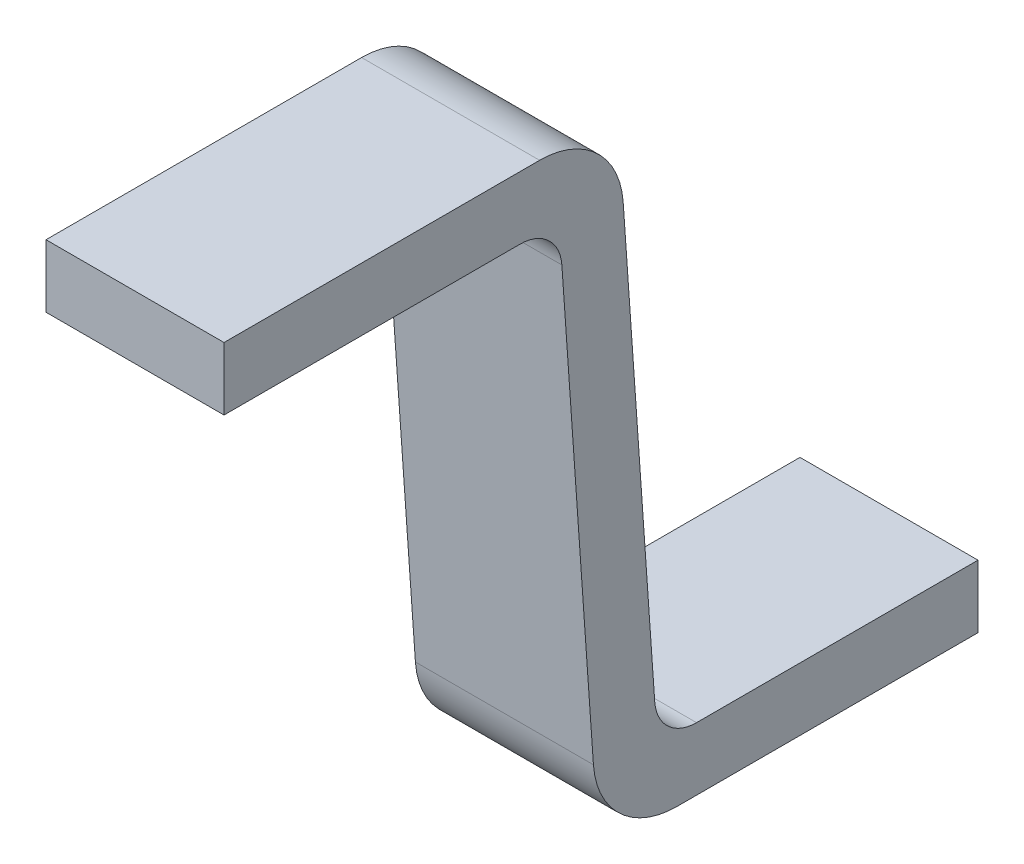
ISO-10303-21;
HEADER;
FILE_DESCRIPTION(('STEP AP214'),'2;1');
FILE_NAME('part.step','',(''),(''),'','','');
FILE_SCHEMA(('AUTOMOTIVE_DESIGN { 1 0 10303 214 1 1 1 1 }'));
ENDSEC;
DATA;
#1=APPLICATION_CONTEXT('core data for automotive mechanical design processes');
#2=APPLICATION_PROTOCOL_DEFINITION('international standard','automotive_design',2000,#1);
#3=PRODUCT_CONTEXT('',#1,'mechanical');
#4=PRODUCT('Part','Part','',(#3));
#5=PRODUCT_RELATED_PRODUCT_CATEGORY('part','',(#4));
#6=PRODUCT_DEFINITION_FORMATION('','',#4);
#7=PRODUCT_DEFINITION_CONTEXT('part definition',#1,'design');
#8=PRODUCT_DEFINITION('design','',#6,#7);
#9=PRODUCT_DEFINITION_SHAPE('','',#8);
#10=(LENGTH_UNIT() NAMED_UNIT(*) SI_UNIT(.MILLI.,.METRE.));
#11=(NAMED_UNIT(*) PLANE_ANGLE_UNIT() SI_UNIT($,.RADIAN.));
#12=(NAMED_UNIT(*) SI_UNIT($,.STERADIAN.) SOLID_ANGLE_UNIT());
#13=UNCERTAINTY_MEASURE_WITH_UNIT(LENGTH_MEASURE(1.E-05),#10,'distance_accuracy_value','');
#14=(GEOMETRIC_REPRESENTATION_CONTEXT(3) GLOBAL_UNCERTAINTY_ASSIGNED_CONTEXT((#13)) GLOBAL_UNIT_ASSIGNED_CONTEXT((#10,
#11,#12)) REPRESENTATION_CONTEXT('',''));
#15=CARTESIAN_POINT('',(0.,0.,0.));
#16=DIRECTION('',(0.,0.,1.));
#17=DIRECTION('',(1.,0.,0.));
#18=AXIS2_PLACEMENT_3D('',#15,#16,#17);
#19=CARTESIAN_POINT('',(0.425,-0.15,-0.506789743356556));
#20=DIRECTION('',(0.,1.,0.));
#21=DIRECTION('',(0.,0.,-1.));
#22=AXIS2_PLACEMENT_3D('',#19,#20,#21);
#23=PLANE('',#22);
#24=DIRECTION('',(0.,0.,-1.));
#25=VECTOR('',#24,1.);
#26=CARTESIAN_POINT('',(0.,-0.15,-0.506789743356556));
#27=LINE('',#26,#25);
#28=CARTESIAN_POINT('',(0.,-0.15,0.2));
#29=VERTEX_POINT('',#28);
#30=CARTESIAN_POINT('',(0.,-0.15,-0.506789743356556));
#31=VERTEX_POINT('',#30);
#32=EDGE_CURVE('E156',#29,#31,#27,.T.);
#33=ORIENTED_EDGE('',*,*,#32,.T.);
#34=DIRECTION('',(-1.,0.,0.));
#35=VECTOR('',#34,1.);
#36=CARTESIAN_POINT('',(0.425,-0.15,-0.506789743356556));
#37=LINE('',#36,#35);
#38=CARTESIAN_POINT('',(0.425,-0.15,-0.506789743356556));
#39=VERTEX_POINT('',#38);
#40=EDGE_CURVE('E11',#39,#31,#37,.T.);
#41=ORIENTED_EDGE('',*,*,#40,.F.);
#42=DIRECTION('',(0.,0.,-1.));
#43=VECTOR('',#42,1.);
#44=CARTESIAN_POINT('',(0.425,-0.15,-0.506789743356556));
#45=LINE('',#44,#43);
#46=CARTESIAN_POINT('',(0.425,-0.15,0.2));
#47=VERTEX_POINT('',#46);
#48=EDGE_CURVE('E248',#47,#39,#45,.T.);
#49=ORIENTED_EDGE('',*,*,#48,.F.);
#50=DIRECTION('',(1.,0.,0.));
#51=VECTOR('',#50,1.);
#52=CARTESIAN_POINT('',(0.,-0.15,0.2));
#53=LINE('',#52,#51);
#54=EDGE_CURVE('E172',#29,#47,#53,.T.);
#55=ORIENTED_EDGE('',*,*,#54,.F.);
#56=EDGE_LOOP('',(#33,#41,#49,#55));
#57=FACE_BOUND('',#56,.T.);
#58=ADVANCED_FACE('F16',(#57),#23,.F.);
#59=CARTESIAN_POINT('',(0.425,-0.25,-0.506789743356556));
#60=DIRECTION('',(-1.,0.,0.));
#61=DIRECTION('',(0.,0.,1.));
#62=AXIS2_PLACEMENT_3D('',#59,#60,#61);
#63=CYLINDRICAL_SURFACE('',#62,0.1);
#64=CARTESIAN_POINT('',(0.,-0.25,-0.506789743356556));
#65=DIRECTION('',(-1.,0.,0.));
#66=DIRECTION('',(0.,0.,-1.));
#67=AXIS2_PLACEMENT_3D('',#64,#65,#66);
#68=CIRCLE('',#67,0.1);
#69=CARTESIAN_POINT('',(0.,-0.242980322182596,-0.606543059709146));
#70=VERTEX_POINT('',#69);
#71=EDGE_CURVE('E223',#31,#70,#68,.T.);
#72=ORIENTED_EDGE('',*,*,#71,.T.);
#73=DIRECTION('',(-1.,0.,0.));
#74=VECTOR('',#73,1.);
#75=CARTESIAN_POINT('',(0.425,-0.242980322182596,-0.606543059709146));
#76=LINE('',#75,#74);
#77=CARTESIAN_POINT('',(0.425,-0.242980322182596,-0.606543059709146));
#78=VERTEX_POINT('',#77);
#79=EDGE_CURVE('E27',#78,#70,#76,.T.);
#80=ORIENTED_EDGE('',*,*,#79,.F.);
#81=CARTESIAN_POINT('',(0.425,-0.25,-0.506789743356556));
#82=DIRECTION('',(-1.,0.,0.));
#83=DIRECTION('',(0.,0.,-1.));
#84=AXIS2_PLACEMENT_3D('',#81,#82,#83);
#85=CIRCLE('',#84,0.1);
#86=EDGE_CURVE('E243',#39,#78,#85,.T.);
#87=ORIENTED_EDGE('',*,*,#86,.F.);
#88=ORIENTED_EDGE('',*,*,#40,.T.);
#89=EDGE_LOOP('',(#72,#80,#87,#88));
#90=FACE_BOUND('',#89,.T.);
#91=ADVANCED_FACE('F18',(#90),#63,.F.);
#92=CARTESIAN_POINT('',(0.425,-1.31403935563481,-0.681913880581708));
#93=DIRECTION('',(0.,0.0701967781740446,-0.997533163525897));
#94=DIRECTION('',(-1.,0.,0.));
#95=AXIS2_PLACEMENT_3D('',#92,#93,#94);
#96=PLANE('',#95);
#97=DIRECTION('',(0.,-0.997533163525897,-0.0701967781740446));
#98=VECTOR('',#97,1.);
#99=CARTESIAN_POINT('',(0.,-1.31403935563481,-0.681913880581708));
#100=LINE('',#99,#98);
#101=CARTESIAN_POINT('',(0.,-1.31403935563481,-0.681913880581708));
#102=VERTEX_POINT('',#101);
#103=EDGE_CURVE('E226',#70,#102,#100,.T.);
#104=ORIENTED_EDGE('',*,*,#103,.T.);
#105=DIRECTION('',(-1.,0.,0.));
#106=VECTOR('',#105,1.);
#107=CARTESIAN_POINT('',(0.425,-1.31403935563481,-0.681913880581708));
#108=LINE('',#107,#106);
#109=CARTESIAN_POINT('',(0.425,-1.31403935563481,-0.681913880581708));
#110=VERTEX_POINT('',#109);
#111=EDGE_CURVE('E84',#110,#102,#108,.T.);
#112=ORIENTED_EDGE('',*,*,#111,.F.);
#113=DIRECTION('',(0.,-0.997533163525897,-0.0701967781740446));
#114=VECTOR('',#113,1.);
#115=CARTESIAN_POINT('',(0.425,-1.31403935563481,-0.681913880581708));
#116=LINE('',#115,#114);
#117=EDGE_CURVE('E237',#78,#110,#116,.T.);
#118=ORIENTED_EDGE('',*,*,#117,.F.);
#119=ORIENTED_EDGE('',*,*,#79,.T.);
#120=EDGE_LOOP('',(#104,#112,#118,#119));
#121=FACE_BOUND('',#120,.T.);
#122=ADVANCED_FACE('F306',(#121),#96,.F.);
#123=CARTESIAN_POINT('',(0.425,-1.3,-0.881420513286888));
#124=DIRECTION('',(-1.,0.,0.));
#125=DIRECTION('',(0.,0.,1.));
#126=AXIS2_PLACEMENT_3D('',#123,#124,#125);
#127=CYLINDRICAL_SURFACE('',#126,0.2);
#128=CARTESIAN_POINT('',(0.,-1.3,-0.881420513286888));
#129=DIRECTION('',(1.,0.,0.));
#130=DIRECTION('',(0.,0.,1.));
#131=AXIS2_PLACEMENT_3D('',#128,#129,#130);
#132=CIRCLE('',#131,0.2);
#133=CARTESIAN_POINT('',(0.,-1.5,-0.88142051328689));
#134=VERTEX_POINT('',#133);
#135=EDGE_CURVE('E222',#102,#134,#132,.T.);
#136=ORIENTED_EDGE('',*,*,#135,.T.);
#137=DIRECTION('',(-1.,0.,0.));
#138=VECTOR('',#137,1.);
#139=CARTESIAN_POINT('',(0.425,-1.5,-0.88142051328689));
#140=LINE('',#139,#138);
#141=CARTESIAN_POINT('',(0.425,-1.5,-0.88142051328689));
#142=VERTEX_POINT('',#141);
#143=EDGE_CURVE('E193',#142,#134,#140,.T.);
#144=ORIENTED_EDGE('',*,*,#143,.F.);
#145=CARTESIAN_POINT('',(0.425,-1.3,-0.881420513286888));
#146=DIRECTION('',(1.,0.,0.));
#147=DIRECTION('',(0.,0.,1.));
#148=AXIS2_PLACEMENT_3D('',#145,#146,#147);
#149=CIRCLE('',#148,0.2);
#150=EDGE_CURVE('E233',#110,#142,#149,.T.);
#151=ORIENTED_EDGE('',*,*,#150,.F.);
#152=ORIENTED_EDGE('',*,*,#111,.T.);
#153=EDGE_LOOP('',(#136,#144,#151,#152));
#154=FACE_BOUND('',#153,.T.);
#155=ADVANCED_FACE('F302',(#154),#127,.T.);
#156=CARTESIAN_POINT('',(0.425,-1.5,-1.6));
#157=DIRECTION('',(0.,1.,0.));
#158=DIRECTION('',(0.,0.,-1.));
#159=AXIS2_PLACEMENT_3D('',#156,#157,#158);
#160=PLANE('',#159);
#161=DIRECTION('',(0.,0.,-1.));
#162=VECTOR('',#161,1.);
#163=CARTESIAN_POINT('',(0.,-1.5,-1.6));
#164=LINE('',#163,#162);
#165=CARTESIAN_POINT('',(0.,-1.5,-1.6));
#166=VERTEX_POINT('',#165);
#167=EDGE_CURVE('E218',#134,#166,#164,.T.);
#168=ORIENTED_EDGE('',*,*,#167,.T.);
#169=DIRECTION('',(-1.,0.,0.));
#170=VECTOR('',#169,1.);
#171=CARTESIAN_POINT('',(0.425,-1.5,-1.6));
#172=LINE('',#171,#170);
#173=CARTESIAN_POINT('',(0.425,-1.5,-1.6));
#174=VERTEX_POINT('',#173);
#175=EDGE_CURVE('E190',#174,#166,#172,.T.);
#176=ORIENTED_EDGE('',*,*,#175,.F.);
#177=DIRECTION('',(0.,0.,-1.));
#178=VECTOR('',#177,1.);
#179=CARTESIAN_POINT('',(0.425,-1.5,-1.6));
#180=LINE('',#179,#178);
#181=EDGE_CURVE('E229',#142,#174,#180,.T.);
#182=ORIENTED_EDGE('',*,*,#181,.F.);
#183=ORIENTED_EDGE('',*,*,#143,.T.);
#184=EDGE_LOOP('',(#168,#176,#182,#183));
#185=FACE_BOUND('',#184,.T.);
#186=ADVANCED_FACE('F299',(#185),#160,.F.);
#187=CARTESIAN_POINT('',(0.425,-1.35,-1.6));
#188=DIRECTION('',(0.,0.,1.));
#189=DIRECTION('',(1.,0.,0.));
#190=AXIS2_PLACEMENT_3D('',#187,#188,#189);
#191=PLANE('',#190);
#192=DIRECTION('',(0.,1.,0.));
#193=VECTOR('',#192,1.);
#194=CARTESIAN_POINT('',(0.,-1.35,-1.6));
#195=LINE('',#194,#193);
#196=CARTESIAN_POINT('',(0.,-1.35,-1.6));
#197=VERTEX_POINT('',#196);
#198=EDGE_CURVE('E217',#166,#197,#195,.T.);
#199=ORIENTED_EDGE('',*,*,#198,.T.);
#200=DIRECTION('',(-1.,0.,0.));
#201=VECTOR('',#200,1.);
#202=CARTESIAN_POINT('',(0.425,-1.35,-1.6));
#203=LINE('',#202,#201);
#204=CARTESIAN_POINT('',(0.425,-1.35,-1.6));
#205=VERTEX_POINT('',#204);
#206=EDGE_CURVE('E186',#205,#197,#203,.T.);
#207=ORIENTED_EDGE('',*,*,#206,.F.);
#208=DIRECTION('',(0.,1.,0.));
#209=VECTOR('',#208,1.);
#210=CARTESIAN_POINT('',(0.425,-1.35,-1.6));
#211=LINE('',#210,#209);
#212=EDGE_CURVE('E207',#174,#205,#211,.T.);
#213=ORIENTED_EDGE('',*,*,#212,.F.);
#214=ORIENTED_EDGE('',*,*,#175,.T.);
#215=EDGE_LOOP('',(#199,#207,#213,#214));
#216=FACE_BOUND('',#215,.T.);
#217=ADVANCED_FACE('F283',(#216),#191,.F.);
#218=CARTESIAN_POINT('',(0.425,-1.35,-0.928025641608611));
#219=DIRECTION('',(0.,-1.,0.));
#220=DIRECTION('',(0.,0.,-1.));
#221=AXIS2_PLACEMENT_3D('',#218,#219,#220);
#222=PLANE('',#221);
#223=DIRECTION('',(0.,0.,1.));
#224=VECTOR('',#223,1.);
#225=CARTESIAN_POINT('',(0.,-1.35,-0.928025641608611));
#226=LINE('',#225,#224);
#227=CARTESIAN_POINT('',(0.,-1.35,-0.928025641608611));
#228=VERTEX_POINT('',#227);
#229=EDGE_CURVE('E201',#197,#228,#226,.T.);
#230=ORIENTED_EDGE('',*,*,#229,.T.);
#231=DIRECTION('',(-1.,0.,0.));
#232=VECTOR('',#231,1.);
#233=CARTESIAN_POINT('',(0.425,-1.35,-0.928025641608611));
#234=LINE('',#233,#232);
#235=CARTESIAN_POINT('',(0.425,-1.35,-0.928025641608611));
#236=VERTEX_POINT('',#235);
#237=EDGE_CURVE('E183',#236,#228,#234,.T.);
#238=ORIENTED_EDGE('',*,*,#237,.F.);
#239=DIRECTION('',(0.,0.,1.));
#240=VECTOR('',#239,1.);
#241=CARTESIAN_POINT('',(0.425,-1.35,-0.928025641608611));
#242=LINE('',#241,#240);
#243=EDGE_CURVE('E202',#205,#236,#242,.T.);
#244=ORIENTED_EDGE('',*,*,#243,.F.);
#245=ORIENTED_EDGE('',*,*,#206,.T.);
#246=EDGE_LOOP('',(#230,#238,#244,#245));
#247=FACE_BOUND('',#246,.T.);
#248=ADVANCED_FACE('F292',(#247),#222,.F.);
#249=CARTESIAN_POINT('',(0.425,-1.25,-0.928025641608611));
#250=DIRECTION('',(-1.,0.,0.));
#251=DIRECTION('',(0.,0.,1.));
#252=AXIS2_PLACEMENT_3D('',#249,#250,#251);
#253=CYLINDRICAL_SURFACE('',#252,0.1);
#254=CARTESIAN_POINT('',(0.,-1.25,-0.928025641608611));
#255=DIRECTION('',(-1.,0.,0.));
#256=DIRECTION('',(0.,0.,-1.));
#257=AXIS2_PLACEMENT_3D('',#254,#255,#256);
#258=CIRCLE('',#257,0.1);
#259=CARTESIAN_POINT('',(0.,-1.2570196778174,-0.828272325256022));
#260=VERTEX_POINT('',#259);
#261=EDGE_CURVE('E197',#228,#260,#258,.T.);
#262=ORIENTED_EDGE('',*,*,#261,.T.);
#263=DIRECTION('',(-1.,0.,0.));
#264=VECTOR('',#263,1.);
#265=CARTESIAN_POINT('',(0.425,-1.2570196778174,-0.828272325256022));
#266=LINE('',#265,#264);
#267=CARTESIAN_POINT('',(0.425,-1.2570196778174,-0.828272325256022));
#268=VERTEX_POINT('',#267);
#269=EDGE_CURVE('E187',#268,#260,#266,.T.);
#270=ORIENTED_EDGE('',*,*,#269,.F.);
#271=CARTESIAN_POINT('',(0.425,-1.25,-0.928025641608611));
#272=DIRECTION('',(-1.,0.,0.));
#273=DIRECTION('',(0.,0.,-1.));
#274=AXIS2_PLACEMENT_3D('',#271,#272,#273);
#275=CIRCLE('',#274,0.1);
#276=EDGE_CURVE('E206',#236,#268,#275,.T.);
#277=ORIENTED_EDGE('',*,*,#276,.F.);
#278=ORIENTED_EDGE('',*,*,#237,.T.);
#279=EDGE_LOOP('',(#262,#270,#277,#278));
#280=FACE_BOUND('',#279,.T.);
#281=ADVANCED_FACE('F394',(#280),#253,.F.);
#282=CARTESIAN_POINT('',(0.425,-0.185960644365192,-0.752901504383456));
#283=DIRECTION('',(0.,-0.0701967781740448,0.997533163525897));
#284=DIRECTION('',(-1.,0.,0.));
#285=AXIS2_PLACEMENT_3D('',#282,#283,#284);
#286=PLANE('',#285);
#287=DIRECTION('',(0.,0.997533163525897,0.0701967781740448));
#288=VECTOR('',#287,1.);
#289=CARTESIAN_POINT('',(0.,-0.185960644365192,-0.752901504383456));
#290=LINE('',#289,#288);
#291=CARTESIAN_POINT('',(0.,-0.185960644365192,-0.752901504383456));
#292=VERTEX_POINT('',#291);
#293=EDGE_CURVE('E194',#260,#292,#290,.T.);
#294=ORIENTED_EDGE('',*,*,#293,.T.);
#295=DIRECTION('',(-1.,0.,0.));
#296=VECTOR('',#295,1.);
#297=CARTESIAN_POINT('',(0.425,-0.185960644365192,-0.752901504383456));
#298=LINE('',#297,#296);
#299=CARTESIAN_POINT('',(0.425,-0.185960644365192,-0.752901504383456));
#300=VERTEX_POINT('',#299);
#301=EDGE_CURVE('E42',#300,#292,#298,.T.);
#302=ORIENTED_EDGE('',*,*,#301,.F.);
#303=DIRECTION('',(0.,0.997533163525897,0.0701967781740448));
#304=VECTOR('',#303,1.);
#305=CARTESIAN_POINT('',(0.425,-0.185960644365192,-0.752901504383456));
#306=LINE('',#305,#304);
#307=EDGE_CURVE('E210',#268,#300,#306,.T.);
#308=ORIENTED_EDGE('',*,*,#307,.F.);
#309=ORIENTED_EDGE('',*,*,#269,.T.);
#310=EDGE_LOOP('',(#294,#302,#308,#309));
#311=FACE_BOUND('',#310,.T.);
#312=ADVANCED_FACE('F418',(#311),#286,.F.);
#313=CARTESIAN_POINT('',(0.425,-0.2,-0.553394871678277));
#314=DIRECTION('',(-1.,0.,0.));
#315=DIRECTION('',(0.,0.,1.));
#316=AXIS2_PLACEMENT_3D('',#313,#314,#315);
#317=CYLINDRICAL_SURFACE('',#316,0.2);
#318=CARTESIAN_POINT('',(0.,-0.2,-0.553394871678277));
#319=DIRECTION('',(1.,0.,0.));
#320=DIRECTION('',(0.,0.,1.));
#321=AXIS2_PLACEMENT_3D('',#318,#319,#320);
#322=CIRCLE('',#321,0.2);
#323=CARTESIAN_POINT('',(0.,0.,-0.553394871678277));
#324=VERTEX_POINT('',#323);
#325=EDGE_CURVE('E155',#292,#324,#322,.T.);
#326=ORIENTED_EDGE('',*,*,#325,.T.);
#327=DIRECTION('',(-1.,0.,0.));
#328=VECTOR('',#327,1.);
#329=CARTESIAN_POINT('',(0.425,0.,-0.553394871678277));
#330=LINE('',#329,#328);
#331=CARTESIAN_POINT('',(0.425,0.,-0.553394871678277));
#332=VERTEX_POINT('',#331);
#333=EDGE_CURVE('E130',#332,#324,#330,.T.);
#334=ORIENTED_EDGE('',*,*,#333,.F.);
#335=CARTESIAN_POINT('',(0.425,-0.2,-0.553394871678277));
#336=DIRECTION('',(1.,0.,0.));
#337=DIRECTION('',(0.,0.,1.));
#338=AXIS2_PLACEMENT_3D('',#335,#336,#337);
#339=CIRCLE('',#338,0.2);
#340=EDGE_CURVE('E181',#300,#332,#339,.T.);
#341=ORIENTED_EDGE('',*,*,#340,.F.);
#342=ORIENTED_EDGE('',*,*,#301,.T.);
#343=EDGE_LOOP('',(#326,#334,#341,#342));
#344=FACE_BOUND('',#343,.T.);
#345=ADVANCED_FACE('F358',(#344),#317,.T.);
#346=CARTESIAN_POINT('',(0.425,0.,0.));
#347=DIRECTION('',(0.,-1.,0.));
#348=DIRECTION('',(0.,0.,-1.));
#349=AXIS2_PLACEMENT_3D('',#346,#347,#348);
#350=PLANE('',#349);
#351=DIRECTION('',(0.,0.,1.));
#352=VECTOR('',#351,1.);
#353=CARTESIAN_POINT('',(0.,0.,0.));
#354=LINE('',#353,#352);
#355=CARTESIAN_POINT('',(0.,0.,0.2));
#356=VERTEX_POINT('',#355);
#357=EDGE_CURVE('E146',#324,#356,#354,.T.);
#358=ORIENTED_EDGE('',*,*,#357,.T.);
#359=DIRECTION('',(-1.,0.,0.));
#360=VECTOR('',#359,1.);
#361=CARTESIAN_POINT('',(0.,0.,0.2));
#362=LINE('',#361,#360);
#363=CARTESIAN_POINT('',(0.425,0.,0.2));
#364=VERTEX_POINT('',#363);
#365=EDGE_CURVE('E149',#364,#356,#362,.T.);
#366=ORIENTED_EDGE('',*,*,#365,.F.);
#367=DIRECTION('',(0.,0.,1.));
#368=VECTOR('',#367,1.);
#369=CARTESIAN_POINT('',(0.425,0.,0.));
#370=LINE('',#369,#368);
#371=EDGE_CURVE('E20',#332,#364,#370,.T.);
#372=ORIENTED_EDGE('',*,*,#371,.F.);
#373=ORIENTED_EDGE('',*,*,#333,.T.);
#374=EDGE_LOOP('',(#358,#366,#372,#373));
#375=FACE_BOUND('',#374,.T.);
#376=ADVANCED_FACE('F148',(#375),#350,.F.);
#377=CARTESIAN_POINT('',(0.425,-0.2,-0.553394871678277));
#378=DIRECTION('',(-1.,0.,0.));
#379=DIRECTION('',(0.,0.,1.));
#380=AXIS2_PLACEMENT_3D('',#377,#378,#379);
#381=PLANE('',#380);
#382=ORIENTED_EDGE('',*,*,#371,.T.);
#383=DIRECTION('',(0.,1.,0.));
#384=VECTOR('',#383,1.);
#385=CARTESIAN_POINT('',(0.425,0.,0.2));
#386=LINE('',#385,#384);
#387=EDGE_CURVE('E164',#47,#364,#386,.T.);
#388=ORIENTED_EDGE('',*,*,#387,.F.);
#389=ORIENTED_EDGE('',*,*,#48,.T.);
#390=ORIENTED_EDGE('',*,*,#86,.T.);
#391=ORIENTED_EDGE('',*,*,#117,.T.);
#392=ORIENTED_EDGE('',*,*,#150,.T.);
#393=ORIENTED_EDGE('',*,*,#181,.T.);
#394=ORIENTED_EDGE('',*,*,#212,.T.);
#395=ORIENTED_EDGE('',*,*,#243,.T.);
#396=ORIENTED_EDGE('',*,*,#276,.T.);
#397=ORIENTED_EDGE('',*,*,#307,.T.);
#398=ORIENTED_EDGE('',*,*,#340,.T.);
#399=EDGE_LOOP('',(#382,#388,#389,#390,#391,#392,#393,#394,#395,#396,#397,#398));
#400=FACE_BOUND('',#399,.T.);
#401=ADVANCED_FACE('F294',(#400),#381,.F.);
#402=CARTESIAN_POINT('',(0.,-0.2,-0.553394871678277));
#403=DIRECTION('',(-1.,0.,0.));
#404=DIRECTION('',(0.,0.,1.));
#405=AXIS2_PLACEMENT_3D('',#402,#403,#404);
#406=PLANE('',#405);
#407=ORIENTED_EDGE('',*,*,#32,.F.);
#408=DIRECTION('',(0.,-1.,0.));
#409=VECTOR('',#408,1.);
#410=CARTESIAN_POINT('',(0.,0.,0.2));
#411=LINE('',#410,#409);
#412=EDGE_CURVE('E162',#356,#29,#411,.T.);
#413=ORIENTED_EDGE('',*,*,#412,.F.);
#414=ORIENTED_EDGE('',*,*,#357,.F.);
#415=ORIENTED_EDGE('',*,*,#325,.F.);
#416=ORIENTED_EDGE('',*,*,#293,.F.);
#417=ORIENTED_EDGE('',*,*,#261,.F.);
#418=ORIENTED_EDGE('',*,*,#229,.F.);
#419=ORIENTED_EDGE('',*,*,#198,.F.);
#420=ORIENTED_EDGE('',*,*,#167,.F.);
#421=ORIENTED_EDGE('',*,*,#135,.F.);
#422=ORIENTED_EDGE('',*,*,#103,.F.);
#423=ORIENTED_EDGE('',*,*,#71,.F.);
#424=EDGE_LOOP('',(#407,#413,#414,#415,#416,#417,#418,#419,#420,#421,#422,#423));
#425=FACE_BOUND('',#424,.T.);
#426=ADVANCED_FACE('F167',(#425),#406,.T.);
#427=CARTESIAN_POINT('',(0.,-0.15,0.2));
#428=DIRECTION('',(0.,0.,1.));
#429=DIRECTION('',(1.,0.,0.));
#430=AXIS2_PLACEMENT_3D('',#427,#428,#429);
#431=PLANE('',#430);
#432=ORIENTED_EDGE('',*,*,#412,.T.);
#433=ORIENTED_EDGE('',*,*,#54,.T.);
#434=ORIENTED_EDGE('',*,*,#387,.T.);
#435=ORIENTED_EDGE('',*,*,#365,.T.);
#436=EDGE_LOOP('',(#432,#433,#434,#435));
#437=FACE_BOUND('',#436,.T.);
#438=ADVANCED_FACE('F160',(#437),#431,.T.);
#439=CLOSED_SHELL('',(#58,#91,#122,#155,#186,#217,#248,#281,#312,#345,#376,#401,#426,#438));
#440=MANIFOLD_SOLID_BREP('B1',#439);
#441=ADVANCED_BREP_SHAPE_REPRESENTATION('',(#18,#440),#14);
#442=SHAPE_DEFINITION_REPRESENTATION(#9,#441);
ENDSEC;
END-ISO-10303-21;
